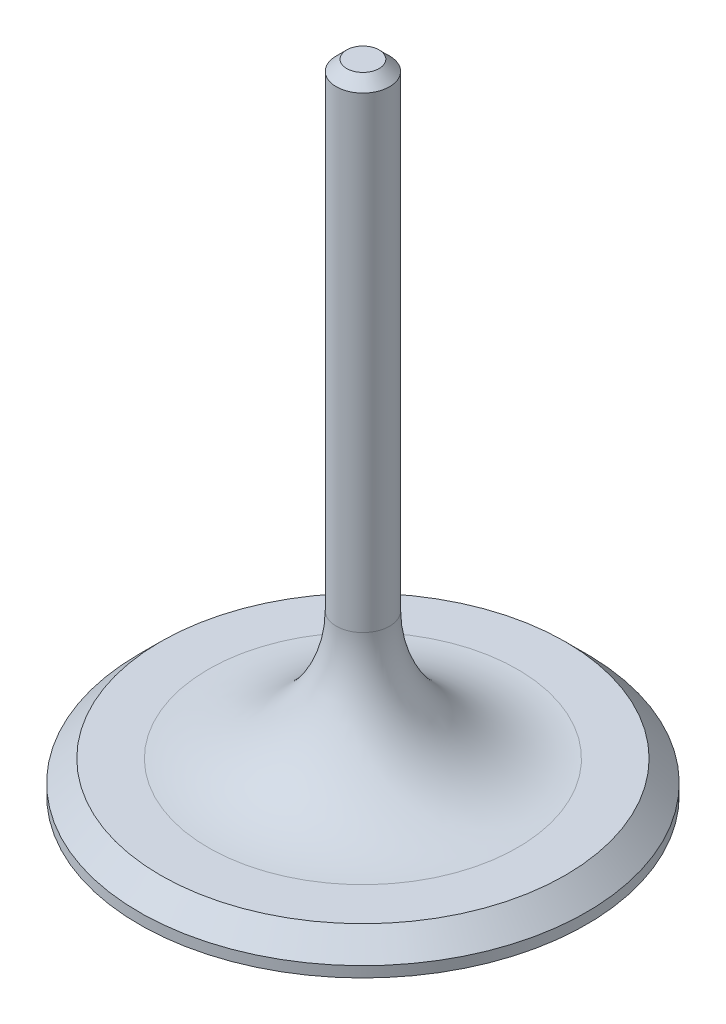
ISO-10303-21;
HEADER;
FILE_DESCRIPTION(('STEP AP214'),'2;1');
FILE_NAME('part.step','',(''),(''),'','','');
FILE_SCHEMA(('AUTOMOTIVE_DESIGN { 1 0 10303 214 1 1 1 1 }'));
ENDSEC;
DATA;
#1=APPLICATION_CONTEXT('core data for automotive mechanical design processes');
#2=APPLICATION_PROTOCOL_DEFINITION('international standard','automotive_design',2000,#1);
#3=PRODUCT_CONTEXT('',#1,'mechanical');
#4=PRODUCT('Part','Part','',(#3));
#5=PRODUCT_RELATED_PRODUCT_CATEGORY('part','',(#4));
#6=PRODUCT_DEFINITION_FORMATION('','',#4);
#7=PRODUCT_DEFINITION_CONTEXT('part definition',#1,'design');
#8=PRODUCT_DEFINITION('design','',#6,#7);
#9=PRODUCT_DEFINITION_SHAPE('','',#8);
#10=(LENGTH_UNIT() NAMED_UNIT(*) SI_UNIT(.MILLI.,.METRE.));
#11=(NAMED_UNIT(*) PLANE_ANGLE_UNIT() SI_UNIT($,.RADIAN.));
#12=(NAMED_UNIT(*) SI_UNIT($,.STERADIAN.) SOLID_ANGLE_UNIT());
#13=UNCERTAINTY_MEASURE_WITH_UNIT(LENGTH_MEASURE(1.E-05),#10,'distance_accuracy_value','');
#14=(GEOMETRIC_REPRESENTATION_CONTEXT(3) GLOBAL_UNCERTAINTY_ASSIGNED_CONTEXT((#13)) GLOBAL_UNIT_ASSIGNED_CONTEXT((#10,
#11,#12)) REPRESENTATION_CONTEXT('',''));
#15=CARTESIAN_POINT('',(0.,0.,0.));
#16=DIRECTION('',(0.,0.,1.));
#17=DIRECTION('',(1.,0.,0.));
#18=AXIS2_PLACEMENT_3D('',#15,#16,#17);
#19=CARTESIAN_POINT('',(0.,76.02,0.));
#20=DIRECTION('',(0.,1.,0.));
#21=DIRECTION('',(-1.,0.,0.));
#22=AXIS2_PLACEMENT_3D('',#19,#20,#21);
#23=CYLINDRICAL_SURFACE('',#22,26.67);
#24=CARTESIAN_POINT('',(0.,1.26999999999999,0.));
#25=DIRECTION('',(0.,1.,0.));
#26=DIRECTION('',(-1.,0.,0.));
#27=AXIS2_PLACEMENT_3D('',#24,#25,#26);
#28=CIRCLE('',#27,26.67);
#29=CARTESIAN_POINT('',(-26.67,1.26999999999999,0.));
#30=VERTEX_POINT('',#29);
#31=EDGE_CURVE('E53',#30,#30,#28,.T.);
#32=ORIENTED_EDGE('',*,*,#31,.F.);
#33=EDGE_LOOP('',(#32));
#34=FACE_BOUND('',#33,.T.);
#35=CARTESIAN_POINT('',(0.,0.,0.));
#36=DIRECTION('',(0.,1.,0.));
#37=DIRECTION('',(-1.,0.,0.));
#38=AXIS2_PLACEMENT_3D('',#35,#36,#37);
#39=CIRCLE('',#38,26.67);
#40=CARTESIAN_POINT('',(-26.67,0.,0.));
#41=VERTEX_POINT('',#40);
#42=EDGE_CURVE('E68',#41,#41,#39,.T.);
#43=ORIENTED_EDGE('',*,*,#42,.T.);
#44=EDGE_LOOP('',(#43));
#45=FACE_BOUND('',#44,.T.);
#46=ADVANCED_FACE('F41',(#34,#45),#23,.T.);
#47=CARTESIAN_POINT('',(0.,1.26999999999999,0.));
#48=DIRECTION('',(0.,-1.,0.));
#49=DIRECTION('',(1.,0.,0.));
#50=AXIS2_PLACEMENT_3D('',#47,#48,#49);
#51=CONICAL_SURFACE('',#50,26.67,0.785398163397448);
#52=CARTESIAN_POINT('',(0.,3.80999999999999,0.));
#53=DIRECTION('',(0.,1.,0.));
#54=DIRECTION('',(-1.,0.,0.));
#55=AXIS2_PLACEMENT_3D('',#52,#53,#54);
#56=CIRCLE('',#55,24.13);
#57=CARTESIAN_POINT('',(-24.13,3.80999999999999,0.));
#58=VERTEX_POINT('',#57);
#59=EDGE_CURVE('E57',#58,#58,#56,.T.);
#60=ORIENTED_EDGE('',*,*,#59,.F.);
#61=EDGE_LOOP('',(#60));
#62=FACE_BOUND('',#61,.T.);
#63=ORIENTED_EDGE('',*,*,#31,.T.);
#64=EDGE_LOOP('',(#63));
#65=FACE_BOUND('',#64,.T.);
#66=ADVANCED_FACE('F85',(#62,#65),#51,.T.);
#67=CARTESIAN_POINT('',(18.43,3.81,0.));
#68=DIRECTION('',(0.,-1.,0.));
#69=DIRECTION('',(1.,0.,0.));
#70=AXIS2_PLACEMENT_3D('',#67,#68,#69);
#71=PLANE('',#70);
#72=CARTESIAN_POINT('',(0.,3.80999999999999,0.));
#73=DIRECTION('',(0.,1.,0.));
#74=DIRECTION('',(-1.,0.,0.));
#75=AXIS2_PLACEMENT_3D('',#72,#73,#74);
#76=CIRCLE('',#75,18.43);
#77=CARTESIAN_POINT('',(-18.43,3.80999999999999,0.));
#78=VERTEX_POINT('',#77);
#79=EDGE_CURVE('E62',#78,#78,#76,.T.);
#80=ORIENTED_EDGE('',*,*,#79,.F.);
#81=EDGE_LOOP('',(#80));
#82=FACE_BOUND('',#81,.T.);
#83=ORIENTED_EDGE('',*,*,#59,.T.);
#84=EDGE_LOOP('',(#83));
#85=FACE_BOUND('',#84,.T.);
#86=ADVANCED_FACE('F90',(#82,#85),#71,.F.);
#87=CARTESIAN_POINT('',(0.,19.06,0.));
#88=DIRECTION('',(0.,1.,0.));
#89=DIRECTION('',(-1.,0.,0.));
#90=AXIS2_PLACEMENT_3D('',#87,#88,#89);
#91=TOROIDAL_SURFACE('',#90,18.43,15.25);
#92=CARTESIAN_POINT('',(0.,19.06,0.));
#93=DIRECTION('',(0.,1.,0.));
#94=DIRECTION('',(-1.,0.,0.));
#95=AXIS2_PLACEMENT_3D('',#92,#93,#94);
#96=CIRCLE('',#95,3.18);
#97=CARTESIAN_POINT('',(-3.18,19.06,0.));
#98=VERTEX_POINT('',#97);
#99=EDGE_CURVE('E65',#98,#98,#96,.T.);
#100=ORIENTED_EDGE('',*,*,#99,.F.);
#101=EDGE_LOOP('',(#100));
#102=FACE_BOUND('',#101,.T.);
#103=ORIENTED_EDGE('',*,*,#79,.T.);
#104=EDGE_LOOP('',(#103));
#105=FACE_BOUND('',#104,.T.);
#106=ADVANCED_FACE('F97',(#102,#105),#91,.F.);
#107=CARTESIAN_POINT('',(0.,76.02,0.));
#108=DIRECTION('',(0.,1.,0.));
#109=DIRECTION('',(-1.,0.,0.));
#110=AXIS2_PLACEMENT_3D('',#107,#108,#109);
#111=CYLINDRICAL_SURFACE('',#110,3.17999999999999);
#112=CARTESIAN_POINT('',(0.,74.77,0.));
#113=DIRECTION('',(0.,-1.,0.));
#114=DIRECTION('',(1.,0.,0.));
#115=AXIS2_PLACEMENT_3D('',#112,#113,#114);
#116=CIRCLE('',#115,3.17999999999999);
#117=CARTESIAN_POINT('',(3.17999999999999,74.77,0.));
#118=VERTEX_POINT('',#117);
#119=EDGE_CURVE('E10',#118,#118,#116,.T.);
#120=ORIENTED_EDGE('',*,*,#119,.T.);
#121=EDGE_LOOP('',(#120));
#122=FACE_BOUND('',#121,.T.);
#123=ORIENTED_EDGE('',*,*,#99,.T.);
#124=EDGE_LOOP('',(#123));
#125=FACE_BOUND('',#124,.T.);
#126=ADVANCED_FACE('F82',(#122,#125),#111,.T.);
#127=CARTESIAN_POINT('',(3.17999999999999,76.02,0.));
#128=DIRECTION('',(0.,-1.,0.));
#129=DIRECTION('',(1.,0.,0.));
#130=AXIS2_PLACEMENT_3D('',#127,#128,#129);
#131=PLANE('',#130);
#132=CARTESIAN_POINT('',(0.,76.02,0.));
#133=DIRECTION('',(0.,-1.,0.));
#134=DIRECTION('',(1.,0.,0.));
#135=AXIS2_PLACEMENT_3D('',#132,#133,#134);
#136=CIRCLE('',#135,1.92999999999999);
#137=CARTESIAN_POINT('',(1.92999999999999,76.02,0.));
#138=VERTEX_POINT('',#137);
#139=EDGE_CURVE('E49',#138,#138,#136,.F.);
#140=ORIENTED_EDGE('',*,*,#139,.T.);
#141=EDGE_LOOP('',(#140));
#142=FACE_BOUND('',#141,.T.);
#143=ADVANCED_FACE('F75',(#142),#131,.F.);
#144=CARTESIAN_POINT('',(26.67,0.,0.));
#145=DIRECTION('',(0.,1.,0.));
#146=DIRECTION('',(-1.,0.,0.));
#147=AXIS2_PLACEMENT_3D('',#144,#145,#146);
#148=PLANE('',#147);
#149=ORIENTED_EDGE('',*,*,#42,.F.);
#150=EDGE_LOOP('',(#149));
#151=FACE_BOUND('',#150,.T.);
#152=ADVANCED_FACE('F73',(#151),#148,.F.);
#153=CARTESIAN_POINT('',(0.,76.02,0.));
#154=DIRECTION('',(0.,-1.,0.));
#155=DIRECTION('',(1.,0.,0.));
#156=AXIS2_PLACEMENT_3D('',#153,#154,#155);
#157=CONICAL_SURFACE('',#156,1.92999999999999,0.785398163397449);
#158=ORIENTED_EDGE('',*,*,#119,.F.);
#159=EDGE_LOOP('',(#158));
#160=FACE_BOUND('',#159,.T.);
#161=ORIENTED_EDGE('',*,*,#139,.F.);
#162=EDGE_LOOP('',(#161));
#163=FACE_BOUND('',#162,.T.);
#164=ADVANCED_FACE('F44',(#160,#163),#157,.T.);
#165=CLOSED_SHELL('',(#46,#66,#86,#106,#126,#143,#152,#164));
#166=MANIFOLD_SOLID_BREP('B2',#165);
#167=ADVANCED_BREP_SHAPE_REPRESENTATION('',(#18,#166),#14);
#168=SHAPE_DEFINITION_REPRESENTATION(#9,#167);
ENDSEC;
END-ISO-10303-21;
